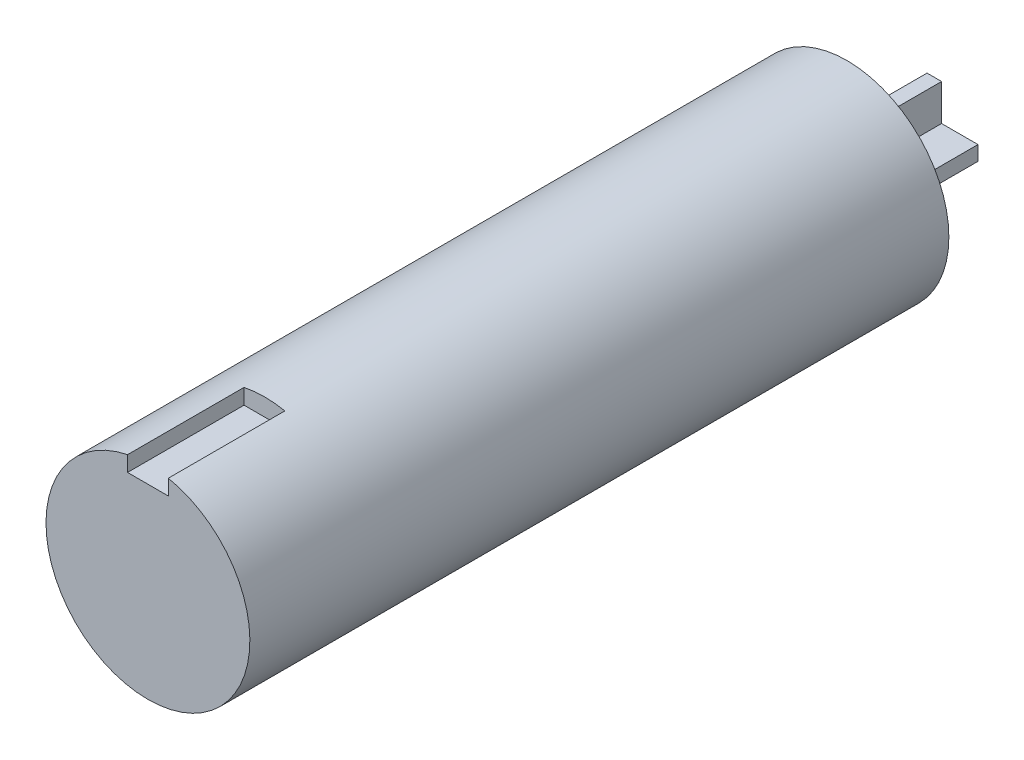
ISO-10303-21;
HEADER;
FILE_DESCRIPTION(('STEP AP214'),'2;1');
FILE_NAME('part.step','',(''),(''),'','','');
FILE_SCHEMA(('AUTOMOTIVE_DESIGN { 1 0 10303 214 1 1 1 1 }'));
ENDSEC;
DATA;
#1=APPLICATION_CONTEXT('core data for automotive mechanical design processes');
#2=APPLICATION_PROTOCOL_DEFINITION('international standard','automotive_design',2000,#1);
#3=PRODUCT_CONTEXT('',#1,'mechanical');
#4=PRODUCT('Part','Part','',(#3));
#5=PRODUCT_RELATED_PRODUCT_CATEGORY('part','',(#4));
#6=PRODUCT_DEFINITION_FORMATION('','',#4);
#7=PRODUCT_DEFINITION_CONTEXT('part definition',#1,'design');
#8=PRODUCT_DEFINITION('design','',#6,#7);
#9=PRODUCT_DEFINITION_SHAPE('','',#8);
#10=(LENGTH_UNIT() NAMED_UNIT(*) SI_UNIT(.MILLI.,.METRE.));
#11=(NAMED_UNIT(*) PLANE_ANGLE_UNIT() SI_UNIT($,.RADIAN.));
#12=(NAMED_UNIT(*) SI_UNIT($,.STERADIAN.) SOLID_ANGLE_UNIT());
#13=UNCERTAINTY_MEASURE_WITH_UNIT(LENGTH_MEASURE(1.E-05),#10,'distance_accuracy_value','');
#14=(GEOMETRIC_REPRESENTATION_CONTEXT(3) GLOBAL_UNCERTAINTY_ASSIGNED_CONTEXT((#13)) GLOBAL_UNIT_ASSIGNED_CONTEXT((#10,
#11,#12)) REPRESENTATION_CONTEXT('',''));
#15=CARTESIAN_POINT('',(0.,0.,0.));
#16=DIRECTION('',(0.,0.,1.));
#17=DIRECTION('',(1.,0.,0.));
#18=AXIS2_PLACEMENT_3D('',#15,#16,#17);
#19=CARTESIAN_POINT('',(-1.25,0.,-15.));
#20=DIRECTION('',(1.,0.,0.));
#21=DIRECTION('',(0.,0.,-1.));
#22=AXIS2_PLACEMENT_3D('',#19,#20,#21);
#23=PLANE('',#22);
#24=DIRECTION('',(0.,1.,0.));
#25=VECTOR('',#24,1.);
#26=CARTESIAN_POINT('',(-1.25,0.,0.));
#27=LINE('',#26,#25);
#28=CARTESIAN_POINT('',(-1.25,1.25,0.));
#29=VERTEX_POINT('',#28);
#30=CARTESIAN_POINT('',(-1.25,7.5,0.));
#31=VERTEX_POINT('',#30);
#32=EDGE_CURVE('E84',#29,#31,#27,.T.);
#33=ORIENTED_EDGE('',*,*,#32,.T.);
#34=DIRECTION('',(0.,0.,1.));
#35=VECTOR('',#34,1.);
#36=CARTESIAN_POINT('',(-1.25,7.5,-15.));
#37=LINE('',#36,#35);
#38=CARTESIAN_POINT('',(-1.25,7.5,-15.));
#39=VERTEX_POINT('',#38);
#40=EDGE_CURVE('E45',#39,#31,#37,.T.);
#41=ORIENTED_EDGE('',*,*,#40,.F.);
#42=DIRECTION('',(0.,1.,0.));
#43=VECTOR('',#42,1.);
#44=CARTESIAN_POINT('',(-1.25,0.,-15.));
#45=LINE('',#44,#43);
#46=CARTESIAN_POINT('',(-1.25,1.25,-15.));
#47=VERTEX_POINT('',#46);
#48=EDGE_CURVE('E172',#47,#39,#45,.T.);
#49=ORIENTED_EDGE('',*,*,#48,.F.);
#50=DIRECTION('',(0.,0.,1.));
#51=VECTOR('',#50,1.);
#52=CARTESIAN_POINT('',(-1.25,1.25,-15.));
#53=LINE('',#52,#51);
#54=EDGE_CURVE('E137',#47,#29,#53,.T.);
#55=ORIENTED_EDGE('',*,*,#54,.T.);
#56=EDGE_LOOP('',(#33,#41,#49,#55));
#57=FACE_BOUND('',#56,.T.);
#58=ADVANCED_FACE('F38',(#57),#23,.F.);
#59=CARTESIAN_POINT('',(0.,7.5,-15.));
#60=DIRECTION('',(0.,-1.,0.));
#61=DIRECTION('',(0.,0.,-1.));
#62=AXIS2_PLACEMENT_3D('',#59,#60,#61);
#63=PLANE('',#62);
#64=DIRECTION('',(1.,0.,0.));
#65=VECTOR('',#64,1.);
#66=CARTESIAN_POINT('',(0.,7.5,0.));
#67=LINE('',#66,#65);
#68=CARTESIAN_POINT('',(1.25,7.5,0.));
#69=VERTEX_POINT('',#68);
#70=EDGE_CURVE('E169',#31,#69,#67,.T.);
#71=ORIENTED_EDGE('',*,*,#70,.T.);
#72=DIRECTION('',(0.,0.,1.));
#73=VECTOR('',#72,1.);
#74=CARTESIAN_POINT('',(1.25,7.5,-15.));
#75=LINE('',#74,#73);
#76=CARTESIAN_POINT('',(1.25,7.5,-15.));
#77=VERTEX_POINT('',#76);
#78=EDGE_CURVE('E124',#77,#69,#75,.T.);
#79=ORIENTED_EDGE('',*,*,#78,.F.);
#80=DIRECTION('',(1.,0.,0.));
#81=VECTOR('',#80,1.);
#82=CARTESIAN_POINT('',(0.,7.5,-15.));
#83=LINE('',#82,#81);
#84=EDGE_CURVE('E61',#39,#77,#83,.T.);
#85=ORIENTED_EDGE('',*,*,#84,.F.);
#86=ORIENTED_EDGE('',*,*,#40,.T.);
#87=EDGE_LOOP('',(#71,#79,#85,#86));
#88=FACE_BOUND('',#87,.T.);
#89=ADVANCED_FACE('F329',(#88),#63,.F.);
#90=CARTESIAN_POINT('',(1.25,0.,-15.));
#91=DIRECTION('',(1.,0.,0.));
#92=DIRECTION('',(0.,0.,-1.));
#93=AXIS2_PLACEMENT_3D('',#90,#91,#92);
#94=PLANE('',#93);
#95=DIRECTION('',(0.,1.,0.));
#96=VECTOR('',#95,1.);
#97=CARTESIAN_POINT('',(1.25,0.,0.));
#98=LINE('',#97,#96);
#99=CARTESIAN_POINT('',(1.25,1.25,0.));
#100=VERTEX_POINT('',#99);
#101=EDGE_CURVE('E74',#100,#69,#98,.T.);
#102=ORIENTED_EDGE('',*,*,#101,.F.);
#103=DIRECTION('',(0.,0.,1.));
#104=VECTOR('',#103,1.);
#105=CARTESIAN_POINT('',(1.25,1.25,-15.));
#106=LINE('',#105,#104);
#107=CARTESIAN_POINT('',(1.25,1.25,-15.));
#108=VERTEX_POINT('',#107);
#109=EDGE_CURVE('E116',#108,#100,#106,.T.);
#110=ORIENTED_EDGE('',*,*,#109,.F.);
#111=DIRECTION('',(0.,1.,0.));
#112=VECTOR('',#111,1.);
#113=CARTESIAN_POINT('',(1.25,0.,-15.));
#114=LINE('',#113,#112);
#115=EDGE_CURVE('E120',#108,#77,#114,.T.);
#116=ORIENTED_EDGE('',*,*,#115,.T.);
#117=ORIENTED_EDGE('',*,*,#78,.T.);
#118=EDGE_LOOP('',(#102,#110,#116,#117));
#119=FACE_BOUND('',#118,.T.);
#120=ADVANCED_FACE('F118',(#119),#94,.T.);
#121=CARTESIAN_POINT('',(0.,1.25,-15.));
#122=DIRECTION('',(0.,-1.,0.));
#123=DIRECTION('',(0.,0.,-1.));
#124=AXIS2_PLACEMENT_3D('',#121,#122,#123);
#125=PLANE('',#124);
#126=DIRECTION('',(1.,0.,0.));
#127=VECTOR('',#126,1.);
#128=CARTESIAN_POINT('',(0.,1.25,0.));
#129=LINE('',#128,#127);
#130=CARTESIAN_POINT('',(7.5,1.25,0.));
#131=VERTEX_POINT('',#130);
#132=EDGE_CURVE('E166',#100,#131,#129,.T.);
#133=ORIENTED_EDGE('',*,*,#132,.T.);
#134=DIRECTION('',(0.,0.,1.));
#135=VECTOR('',#134,1.);
#136=CARTESIAN_POINT('',(7.5,1.25,-15.));
#137=LINE('',#136,#135);
#138=CARTESIAN_POINT('',(7.5,1.25,-15.));
#139=VERTEX_POINT('',#138);
#140=EDGE_CURVE('E125',#139,#131,#137,.T.);
#141=ORIENTED_EDGE('',*,*,#140,.F.);
#142=DIRECTION('',(1.,0.,0.));
#143=VECTOR('',#142,1.);
#144=CARTESIAN_POINT('',(0.,1.25,-15.));
#145=LINE('',#144,#143);
#146=EDGE_CURVE('E128',#108,#139,#145,.T.);
#147=ORIENTED_EDGE('',*,*,#146,.F.);
#148=ORIENTED_EDGE('',*,*,#109,.T.);
#149=EDGE_LOOP('',(#133,#141,#147,#148));
#150=FACE_BOUND('',#149,.T.);
#151=ADVANCED_FACE('F129',(#150),#125,.F.);
#152=CARTESIAN_POINT('',(7.5,0.,-15.));
#153=DIRECTION('',(-1.,0.,0.));
#154=DIRECTION('',(0.,0.,1.));
#155=AXIS2_PLACEMENT_3D('',#152,#153,#154);
#156=PLANE('',#155);
#157=DIRECTION('',(0.,-1.,0.));
#158=VECTOR('',#157,1.);
#159=CARTESIAN_POINT('',(7.5,0.,0.));
#160=LINE('',#159,#158);
#161=CARTESIAN_POINT('',(7.5,-1.25,0.));
#162=VERTEX_POINT('',#161);
#163=EDGE_CURVE('E163',#131,#162,#160,.T.);
#164=ORIENTED_EDGE('',*,*,#163,.T.);
#165=DIRECTION('',(0.,0.,1.));
#166=VECTOR('',#165,1.);
#167=CARTESIAN_POINT('',(7.5,-1.25,-15.));
#168=LINE('',#167,#166);
#169=CARTESIAN_POINT('',(7.5,-1.25,-15.));
#170=VERTEX_POINT('',#169);
#171=EDGE_CURVE('E176',#170,#162,#168,.T.);
#172=ORIENTED_EDGE('',*,*,#171,.F.);
#173=DIRECTION('',(0.,-1.,0.));
#174=VECTOR('',#173,1.);
#175=CARTESIAN_POINT('',(7.5,0.,-15.));
#176=LINE('',#175,#174);
#177=EDGE_CURVE('E133',#139,#170,#176,.T.);
#178=ORIENTED_EDGE('',*,*,#177,.F.);
#179=ORIENTED_EDGE('',*,*,#140,.T.);
#180=EDGE_LOOP('',(#164,#172,#178,#179));
#181=FACE_BOUND('',#180,.T.);
#182=ADVANCED_FACE('F319',(#181),#156,.F.);
#183=CARTESIAN_POINT('',(0.,-1.25,-15.));
#184=DIRECTION('',(0.,-1.,0.));
#185=DIRECTION('',(0.,0.,-1.));
#186=AXIS2_PLACEMENT_3D('',#183,#184,#185);
#187=PLANE('',#186);
#188=DIRECTION('',(1.,0.,0.));
#189=VECTOR('',#188,1.);
#190=CARTESIAN_POINT('',(0.,-1.25,0.));
#191=LINE('',#190,#189);
#192=CARTESIAN_POINT('',(1.25,-1.25,0.));
#193=VERTEX_POINT('',#192);
#194=EDGE_CURVE('E160',#193,#162,#191,.T.);
#195=ORIENTED_EDGE('',*,*,#194,.F.);
#196=DIRECTION('',(0.,0.,1.));
#197=VECTOR('',#196,1.);
#198=CARTESIAN_POINT('',(1.25,-1.25,-15.));
#199=LINE('',#198,#197);
#200=CARTESIAN_POINT('',(1.25,-1.25,-15.));
#201=VERTEX_POINT('',#200);
#202=EDGE_CURVE('E179',#201,#193,#199,.T.);
#203=ORIENTED_EDGE('',*,*,#202,.F.);
#204=DIRECTION('',(1.,0.,0.));
#205=VECTOR('',#204,1.);
#206=CARTESIAN_POINT('',(0.,-1.25,-15.));
#207=LINE('',#206,#205);
#208=EDGE_CURVE('E313',#201,#170,#207,.T.);
#209=ORIENTED_EDGE('',*,*,#208,.T.);
#210=ORIENTED_EDGE('',*,*,#171,.T.);
#211=EDGE_LOOP('',(#195,#203,#209,#210));
#212=FACE_BOUND('',#211,.T.);
#213=ADVANCED_FACE('F322',(#212),#187,.T.);
#214=CARTESIAN_POINT('',(1.25,0.,-15.));
#215=DIRECTION('',(1.,0.,0.));
#216=DIRECTION('',(0.,0.,-1.));
#217=AXIS2_PLACEMENT_3D('',#214,#215,#216);
#218=PLANE('',#217);
#219=DIRECTION('',(0.,1.,0.));
#220=VECTOR('',#219,1.);
#221=CARTESIAN_POINT('',(1.25,0.,0.));
#222=LINE('',#221,#220);
#223=CARTESIAN_POINT('',(1.25,-7.5,0.));
#224=VERTEX_POINT('',#223);
#225=EDGE_CURVE('E157',#224,#193,#222,.T.);
#226=ORIENTED_EDGE('',*,*,#225,.F.);
#227=DIRECTION('',(0.,0.,1.));
#228=VECTOR('',#227,1.);
#229=CARTESIAN_POINT('',(1.25,-7.5,-15.));
#230=LINE('',#229,#228);
#231=CARTESIAN_POINT('',(1.25,-7.5,-15.));
#232=VERTEX_POINT('',#231);
#233=EDGE_CURVE('E182',#232,#224,#230,.T.);
#234=ORIENTED_EDGE('',*,*,#233,.F.);
#235=DIRECTION('',(0.,1.,0.));
#236=VECTOR('',#235,1.);
#237=CARTESIAN_POINT('',(1.25,0.,-15.));
#238=LINE('',#237,#236);
#239=EDGE_CURVE('E310',#232,#201,#238,.T.);
#240=ORIENTED_EDGE('',*,*,#239,.T.);
#241=ORIENTED_EDGE('',*,*,#202,.T.);
#242=EDGE_LOOP('',(#226,#234,#240,#241));
#243=FACE_BOUND('',#242,.T.);
#244=ADVANCED_FACE('F325',(#243),#218,.T.);
#245=CARTESIAN_POINT('',(0.,-7.5,-15.));
#246=DIRECTION('',(0.,-1.,0.));
#247=DIRECTION('',(0.,0.,-1.));
#248=AXIS2_PLACEMENT_3D('',#245,#246,#247);
#249=PLANE('',#248);
#250=DIRECTION('',(1.,0.,0.));
#251=VECTOR('',#250,1.);
#252=CARTESIAN_POINT('',(0.,-7.5,0.));
#253=LINE('',#252,#251);
#254=CARTESIAN_POINT('',(-1.25,-7.5,0.));
#255=VERTEX_POINT('',#254);
#256=EDGE_CURVE('E154',#255,#224,#253,.T.);
#257=ORIENTED_EDGE('',*,*,#256,.F.);
#258=DIRECTION('',(0.,0.,1.));
#259=VECTOR('',#258,1.);
#260=CARTESIAN_POINT('',(-1.25,-7.5,-15.));
#261=LINE('',#260,#259);
#262=CARTESIAN_POINT('',(-1.25,-7.5,-15.));
#263=VERTEX_POINT('',#262);
#264=EDGE_CURVE('E185',#263,#255,#261,.T.);
#265=ORIENTED_EDGE('',*,*,#264,.F.);
#266=DIRECTION('',(1.,0.,0.));
#267=VECTOR('',#266,1.);
#268=CARTESIAN_POINT('',(0.,-7.5,-15.));
#269=LINE('',#268,#267);
#270=EDGE_CURVE('E307',#263,#232,#269,.T.);
#271=ORIENTED_EDGE('',*,*,#270,.T.);
#272=ORIENTED_EDGE('',*,*,#233,.T.);
#273=EDGE_LOOP('',(#257,#265,#271,#272));
#274=FACE_BOUND('',#273,.T.);
#275=ADVANCED_FACE('F328',(#274),#249,.T.);
#276=CARTESIAN_POINT('',(-1.25,0.,-15.));
#277=DIRECTION('',(1.,0.,0.));
#278=DIRECTION('',(0.,0.,-1.));
#279=AXIS2_PLACEMENT_3D('',#276,#277,#278);
#280=PLANE('',#279);
#281=DIRECTION('',(0.,1.,0.));
#282=VECTOR('',#281,1.);
#283=CARTESIAN_POINT('',(-1.25,0.,0.));
#284=LINE('',#283,#282);
#285=CARTESIAN_POINT('',(-1.25,-1.25,0.));
#286=VERTEX_POINT('',#285);
#287=EDGE_CURVE('E151',#255,#286,#284,.T.);
#288=ORIENTED_EDGE('',*,*,#287,.T.);
#289=DIRECTION('',(0.,0.,1.));
#290=VECTOR('',#289,1.);
#291=CARTESIAN_POINT('',(-1.25,-1.25,-15.));
#292=LINE('',#291,#290);
#293=CARTESIAN_POINT('',(-1.25,-1.25,-15.));
#294=VERTEX_POINT('',#293);
#295=EDGE_CURVE('E188',#294,#286,#292,.T.);
#296=ORIENTED_EDGE('',*,*,#295,.F.);
#297=DIRECTION('',(0.,1.,0.));
#298=VECTOR('',#297,1.);
#299=CARTESIAN_POINT('',(-1.25,0.,-15.));
#300=LINE('',#299,#298);
#301=EDGE_CURVE('E305',#263,#294,#300,.T.);
#302=ORIENTED_EDGE('',*,*,#301,.F.);
#303=ORIENTED_EDGE('',*,*,#264,.T.);
#304=EDGE_LOOP('',(#288,#296,#302,#303));
#305=FACE_BOUND('',#304,.T.);
#306=ADVANCED_FACE('F227',(#305),#280,.F.);
#307=CARTESIAN_POINT('',(0.,-1.25,-15.));
#308=DIRECTION('',(0.,-1.,0.));
#309=DIRECTION('',(0.,0.,-1.));
#310=AXIS2_PLACEMENT_3D('',#307,#308,#309);
#311=PLANE('',#310);
#312=DIRECTION('',(1.,0.,0.));
#313=VECTOR('',#312,1.);
#314=CARTESIAN_POINT('',(0.,-1.25,0.));
#315=LINE('',#314,#313);
#316=CARTESIAN_POINT('',(-7.5,-1.25,0.));
#317=VERTEX_POINT('',#316);
#318=EDGE_CURVE('E148',#317,#286,#315,.T.);
#319=ORIENTED_EDGE('',*,*,#318,.F.);
#320=DIRECTION('',(0.,0.,1.));
#321=VECTOR('',#320,1.);
#322=CARTESIAN_POINT('',(-7.5,-1.25,-15.));
#323=LINE('',#322,#321);
#324=CARTESIAN_POINT('',(-7.5,-1.25,-15.));
#325=VERTEX_POINT('',#324);
#326=EDGE_CURVE('E191',#325,#317,#323,.T.);
#327=ORIENTED_EDGE('',*,*,#326,.F.);
#328=DIRECTION('',(1.,0.,0.));
#329=VECTOR('',#328,1.);
#330=CARTESIAN_POINT('',(0.,-1.25,-15.));
#331=LINE('',#330,#329);
#332=EDGE_CURVE('E222',#325,#294,#331,.T.);
#333=ORIENTED_EDGE('',*,*,#332,.T.);
#334=ORIENTED_EDGE('',*,*,#295,.T.);
#335=EDGE_LOOP('',(#319,#327,#333,#334));
#336=FACE_BOUND('',#335,.T.);
#337=ADVANCED_FACE('F220',(#336),#311,.T.);
#338=CARTESIAN_POINT('',(-7.5,0.,-15.));
#339=DIRECTION('',(-1.,0.,0.));
#340=DIRECTION('',(0.,0.,1.));
#341=AXIS2_PLACEMENT_3D('',#338,#339,#340);
#342=PLANE('',#341);
#343=DIRECTION('',(0.,-1.,0.));
#344=VECTOR('',#343,1.);
#345=CARTESIAN_POINT('',(-7.5,0.,0.));
#346=LINE('',#345,#344);
#347=CARTESIAN_POINT('',(-7.5,1.25,0.));
#348=VERTEX_POINT('',#347);
#349=EDGE_CURVE('E145',#348,#317,#346,.T.);
#350=ORIENTED_EDGE('',*,*,#349,.F.);
#351=DIRECTION('',(0.,0.,1.));
#352=VECTOR('',#351,1.);
#353=CARTESIAN_POINT('',(-7.5,1.25,-15.));
#354=LINE('',#353,#352);
#355=CARTESIAN_POINT('',(-7.5,1.25,-15.));
#356=VERTEX_POINT('',#355);
#357=EDGE_CURVE('E194',#356,#348,#354,.T.);
#358=ORIENTED_EDGE('',*,*,#357,.F.);
#359=DIRECTION('',(0.,-1.,0.));
#360=VECTOR('',#359,1.);
#361=CARTESIAN_POINT('',(-7.5,0.,-15.));
#362=LINE('',#361,#360);
#363=EDGE_CURVE('E216',#356,#325,#362,.T.);
#364=ORIENTED_EDGE('',*,*,#363,.T.);
#365=ORIENTED_EDGE('',*,*,#326,.T.);
#366=EDGE_LOOP('',(#350,#358,#364,#365));
#367=FACE_BOUND('',#366,.T.);
#368=ADVANCED_FACE('F215',(#367),#342,.T.);
#369=CARTESIAN_POINT('',(0.,1.25,-15.));
#370=DIRECTION('',(0.,-1.,0.));
#371=DIRECTION('',(0.,0.,-1.));
#372=AXIS2_PLACEMENT_3D('',#369,#370,#371);
#373=PLANE('',#372);
#374=DIRECTION('',(1.,0.,0.));
#375=VECTOR('',#374,1.);
#376=CARTESIAN_POINT('',(0.,1.25,0.));
#377=LINE('',#376,#375);
#378=EDGE_CURVE('E142',#348,#29,#377,.T.);
#379=ORIENTED_EDGE('',*,*,#378,.T.);
#380=ORIENTED_EDGE('',*,*,#54,.F.);
#381=DIRECTION('',(1.,0.,0.));
#382=VECTOR('',#381,1.);
#383=CARTESIAN_POINT('',(0.,1.25,-15.));
#384=LINE('',#383,#382);
#385=EDGE_CURVE('E205',#356,#47,#384,.T.);
#386=ORIENTED_EDGE('',*,*,#385,.F.);
#387=ORIENTED_EDGE('',*,*,#357,.T.);
#388=EDGE_LOOP('',(#379,#380,#386,#387));
#389=FACE_BOUND('',#388,.T.);
#390=ADVANCED_FACE('F204',(#389),#373,.F.);
#391=CARTESIAN_POINT('',(0.,0.,-15.));
#392=DIRECTION('',(0.,0.,1.));
#393=DIRECTION('',(1.,0.,0.));
#394=AXIS2_PLACEMENT_3D('',#391,#392,#393);
#395=PLANE('',#394);
#396=ORIENTED_EDGE('',*,*,#48,.T.);
#397=ORIENTED_EDGE('',*,*,#84,.T.);
#398=ORIENTED_EDGE('',*,*,#115,.F.);
#399=ORIENTED_EDGE('',*,*,#146,.T.);
#400=ORIENTED_EDGE('',*,*,#177,.T.);
#401=ORIENTED_EDGE('',*,*,#208,.F.);
#402=ORIENTED_EDGE('',*,*,#239,.F.);
#403=ORIENTED_EDGE('',*,*,#270,.F.);
#404=ORIENTED_EDGE('',*,*,#301,.T.);
#405=ORIENTED_EDGE('',*,*,#332,.F.);
#406=ORIENTED_EDGE('',*,*,#363,.F.);
#407=ORIENTED_EDGE('',*,*,#385,.T.);
#408=EDGE_LOOP('',(#396,#397,#398,#399,#400,#401,#402,#403,#404,#405,#406,#407));
#409=FACE_BOUND('',#408,.T.);
#410=ADVANCED_FACE('F135',(#409),#395,.F.);
#411=CARTESIAN_POINT('',(0.,0.,120.));
#412=DIRECTION('',(0.,0.,-1.));
#413=DIRECTION('',(-1.,0.,0.));
#414=AXIS2_PLACEMENT_3D('',#411,#412,#413);
#415=CYLINDRICAL_SURFACE('',#414,17.5);
#416=CARTESIAN_POINT('',(0.,0.,120.));
#417=DIRECTION('',(0.,0.,1.));
#418=DIRECTION('',(1.,0.,0.));
#419=AXIS2_PLACEMENT_3D('',#416,#417,#418);
#420=CIRCLE('',#419,17.5);
#421=CARTESIAN_POINT('',(-3.5,17.1464281994823,120.));
#422=VERTEX_POINT('',#421);
#423=CARTESIAN_POINT('',(3.5,17.1464281994823,120.));
#424=VERTEX_POINT('',#423);
#425=EDGE_CURVE('E143',#422,#424,#420,.T.);
#426=ORIENTED_EDGE('',*,*,#425,.F.);
#427=DIRECTION('',(0.,0.,-1.));
#428=VECTOR('',#427,1.);
#429=CARTESIAN_POINT('',(-3.5,17.1464281994823,120.));
#430=LINE('',#429,#428);
#431=CARTESIAN_POINT('',(-3.5,17.1464281994823,100.));
#432=VERTEX_POINT('',#431);
#433=EDGE_CURVE('E288',#422,#432,#430,.T.);
#434=ORIENTED_EDGE('',*,*,#433,.T.);
#435=CARTESIAN_POINT('',(0.,0.,100.));
#436=DIRECTION('',(0.,0.,-1.));
#437=DIRECTION('',(-1.,0.,0.));
#438=AXIS2_PLACEMENT_3D('',#435,#436,#437);
#439=CIRCLE('',#438,17.5);
#440=CARTESIAN_POINT('',(3.5,17.1464281994823,100.));
#441=VERTEX_POINT('',#440);
#442=EDGE_CURVE('E11',#432,#441,#439,.T.);
#443=ORIENTED_EDGE('',*,*,#442,.T.);
#444=DIRECTION('',(0.,0.,-1.));
#445=VECTOR('',#444,1.);
#446=CARTESIAN_POINT('',(3.5,17.1464281994823,120.));
#447=LINE('',#446,#445);
#448=EDGE_CURVE('E270',#441,#424,#447,.F.);
#449=ORIENTED_EDGE('',*,*,#448,.T.);
#450=EDGE_LOOP('',(#426,#434,#443,#449));
#451=FACE_BOUND('',#450,.T.);
#452=CARTESIAN_POINT('',(0.,0.,0.));
#453=DIRECTION('',(0.,0.,1.));
#454=DIRECTION('',(1.,0.,0.));
#455=AXIS2_PLACEMENT_3D('',#452,#453,#454);
#456=CIRCLE('',#455,17.5);
#457=CARTESIAN_POINT('',(17.5,0.,0.));
#458=VERTEX_POINT('',#457);
#459=EDGE_CURVE('E296',#458,#458,#456,.T.);
#460=ORIENTED_EDGE('',*,*,#459,.T.);
#461=EDGE_LOOP('',(#460));
#462=FACE_BOUND('',#461,.T.);
#463=ADVANCED_FACE('F359',(#451,#462),#415,.T.);
#464=CARTESIAN_POINT('',(0.,0.,120.));
#465=DIRECTION('',(0.,0.,1.));
#466=DIRECTION('',(1.,0.,0.));
#467=AXIS2_PLACEMENT_3D('',#464,#465,#466);
#468=PLANE('',#467);
#469=DIRECTION('',(0.,1.,0.));
#470=VECTOR('',#469,1.);
#471=CARTESIAN_POINT('',(3.5,14.5,120.));
#472=LINE('',#471,#470);
#473=CARTESIAN_POINT('',(3.5,14.5,120.));
#474=VERTEX_POINT('',#473);
#475=EDGE_CURVE('E286',#474,#424,#472,.T.);
#476=ORIENTED_EDGE('',*,*,#475,.F.);
#477=DIRECTION('',(1.,0.,0.));
#478=VECTOR('',#477,1.);
#479=CARTESIAN_POINT('',(-3.5,14.5,120.));
#480=LINE('',#479,#478);
#481=CARTESIAN_POINT('',(-3.5,14.5,120.));
#482=VERTEX_POINT('',#481);
#483=EDGE_CURVE('E273',#482,#474,#480,.T.);
#484=ORIENTED_EDGE('',*,*,#483,.F.);
#485=DIRECTION('',(0.,1.,0.));
#486=VECTOR('',#485,1.);
#487=CARTESIAN_POINT('',(-3.5,14.5,120.));
#488=LINE('',#487,#486);
#489=EDGE_CURVE('E289',#482,#422,#488,.T.);
#490=ORIENTED_EDGE('',*,*,#489,.T.);
#491=ORIENTED_EDGE('',*,*,#425,.T.);
#492=EDGE_LOOP('',(#476,#484,#490,#491));
#493=FACE_BOUND('',#492,.T.);
#494=ADVANCED_FACE('F363',(#493),#468,.T.);
#495=CARTESIAN_POINT('',(0.,0.,0.));
#496=DIRECTION('',(0.,0.,1.));
#497=DIRECTION('',(1.,0.,0.));
#498=AXIS2_PLACEMENT_3D('',#495,#496,#497);
#499=PLANE('',#498);
#500=ORIENTED_EDGE('',*,*,#32,.F.);
#501=ORIENTED_EDGE('',*,*,#378,.F.);
#502=ORIENTED_EDGE('',*,*,#349,.T.);
#503=ORIENTED_EDGE('',*,*,#318,.T.);
#504=ORIENTED_EDGE('',*,*,#287,.F.);
#505=ORIENTED_EDGE('',*,*,#256,.T.);
#506=ORIENTED_EDGE('',*,*,#225,.T.);
#507=ORIENTED_EDGE('',*,*,#194,.T.);
#508=ORIENTED_EDGE('',*,*,#163,.F.);
#509=ORIENTED_EDGE('',*,*,#132,.F.);
#510=ORIENTED_EDGE('',*,*,#101,.T.);
#511=ORIENTED_EDGE('',*,*,#70,.F.);
#512=EDGE_LOOP('',(#500,#501,#502,#503,#504,#505,#506,#507,#508,#509,#510,#511));
#513=FACE_BOUND('',#512,.T.);
#514=ORIENTED_EDGE('',*,*,#459,.F.);
#515=EDGE_LOOP('',(#514));
#516=FACE_BOUND('',#515,.T.);
#517=ADVANCED_FACE('F208',(#513,#516),#499,.F.);
#518=CARTESIAN_POINT('',(-3.5,14.5,100.));
#519=DIRECTION('',(0.,0.,-1.));
#520=DIRECTION('',(-1.,0.,0.));
#521=AXIS2_PLACEMENT_3D('',#518,#519,#520);
#522=PLANE('',#521);
#523=DIRECTION('',(0.,1.,0.));
#524=VECTOR('',#523,1.);
#525=CARTESIAN_POINT('',(-3.5,14.5,100.));
#526=LINE('',#525,#524);
#527=CARTESIAN_POINT('',(-3.5,14.5,100.));
#528=VERTEX_POINT('',#527);
#529=EDGE_CURVE('E272',#528,#432,#526,.T.);
#530=ORIENTED_EDGE('',*,*,#529,.F.);
#531=DIRECTION('',(-1.,0.,0.));
#532=VECTOR('',#531,1.);
#533=CARTESIAN_POINT('',(-3.5,14.5,100.));
#534=LINE('',#533,#532);
#535=CARTESIAN_POINT('',(3.5,14.5,100.));
#536=VERTEX_POINT('',#535);
#537=EDGE_CURVE('E275',#536,#528,#534,.T.);
#538=ORIENTED_EDGE('',*,*,#537,.F.);
#539=DIRECTION('',(0.,1.,0.));
#540=VECTOR('',#539,1.);
#541=CARTESIAN_POINT('',(3.5,14.5,100.));
#542=LINE('',#541,#540);
#543=EDGE_CURVE('E264',#536,#441,#542,.T.);
#544=ORIENTED_EDGE('',*,*,#543,.T.);
#545=ORIENTED_EDGE('',*,*,#442,.F.);
#546=EDGE_LOOP('',(#530,#538,#544,#545));
#547=FACE_BOUND('',#546,.T.);
#548=ADVANCED_FACE('F276',(#547),#522,.F.);
#549=CARTESIAN_POINT('',(3.5,14.5,100.));
#550=DIRECTION('',(1.,0.,0.));
#551=DIRECTION('',(0.,0.,-1.));
#552=AXIS2_PLACEMENT_3D('',#549,#550,#551);
#553=PLANE('',#552);
#554=ORIENTED_EDGE('',*,*,#543,.F.);
#555=DIRECTION('',(0.,0.,-1.));
#556=VECTOR('',#555,1.);
#557=CARTESIAN_POINT('',(3.5,14.5,100.));
#558=LINE('',#557,#556);
#559=EDGE_CURVE('E268',#474,#536,#558,.T.);
#560=ORIENTED_EDGE('',*,*,#559,.F.);
#561=ORIENTED_EDGE('',*,*,#475,.T.);
#562=ORIENTED_EDGE('',*,*,#448,.F.);
#563=EDGE_LOOP('',(#554,#560,#561,#562));
#564=FACE_BOUND('',#563,.T.);
#565=ADVANCED_FACE('F266',(#564),#553,.F.);
#566=CARTESIAN_POINT('',(-3.5,14.5,100.));
#567=DIRECTION('',(-1.,0.,0.));
#568=DIRECTION('',(0.,0.,1.));
#569=AXIS2_PLACEMENT_3D('',#566,#567,#568);
#570=PLANE('',#569);
#571=ORIENTED_EDGE('',*,*,#489,.F.);
#572=DIRECTION('',(0.,0.,1.));
#573=VECTOR('',#572,1.);
#574=CARTESIAN_POINT('',(-3.5,14.5,100.));
#575=LINE('',#574,#573);
#576=EDGE_CURVE('E52',#528,#482,#575,.T.);
#577=ORIENTED_EDGE('',*,*,#576,.F.);
#578=ORIENTED_EDGE('',*,*,#529,.T.);
#579=ORIENTED_EDGE('',*,*,#433,.F.);
#580=EDGE_LOOP('',(#571,#577,#578,#579));
#581=FACE_BOUND('',#580,.T.);
#582=ADVANCED_FACE('F377',(#581),#570,.F.);
#583=CARTESIAN_POINT('',(0.,14.5,0.));
#584=DIRECTION('',(0.,1.,0.));
#585=DIRECTION('',(0.,0.,1.));
#586=AXIS2_PLACEMENT_3D('',#583,#584,#585);
#587=PLANE('',#586);
#588=ORIENTED_EDGE('',*,*,#559,.T.);
#589=ORIENTED_EDGE('',*,*,#537,.T.);
#590=ORIENTED_EDGE('',*,*,#576,.T.);
#591=ORIENTED_EDGE('',*,*,#483,.T.);
#592=EDGE_LOOP('',(#588,#589,#590,#591));
#593=FACE_BOUND('',#592,.T.);
#594=ADVANCED_FACE('F279',(#593),#587,.T.);
#595=CLOSED_SHELL('',(#58,#89,#120,#151,#182,#213,#244,#275,#306,#337,#368,#390,#410,#463,#494,
#517,#548,#565,#582,#594));
#596=MANIFOLD_SOLID_BREP('B2',#595);
#597=ADVANCED_BREP_SHAPE_REPRESENTATION('',(#18,#596),#14);
#598=SHAPE_DEFINITION_REPRESENTATION(#9,#597);
ENDSEC;
END-ISO-10303-21;
